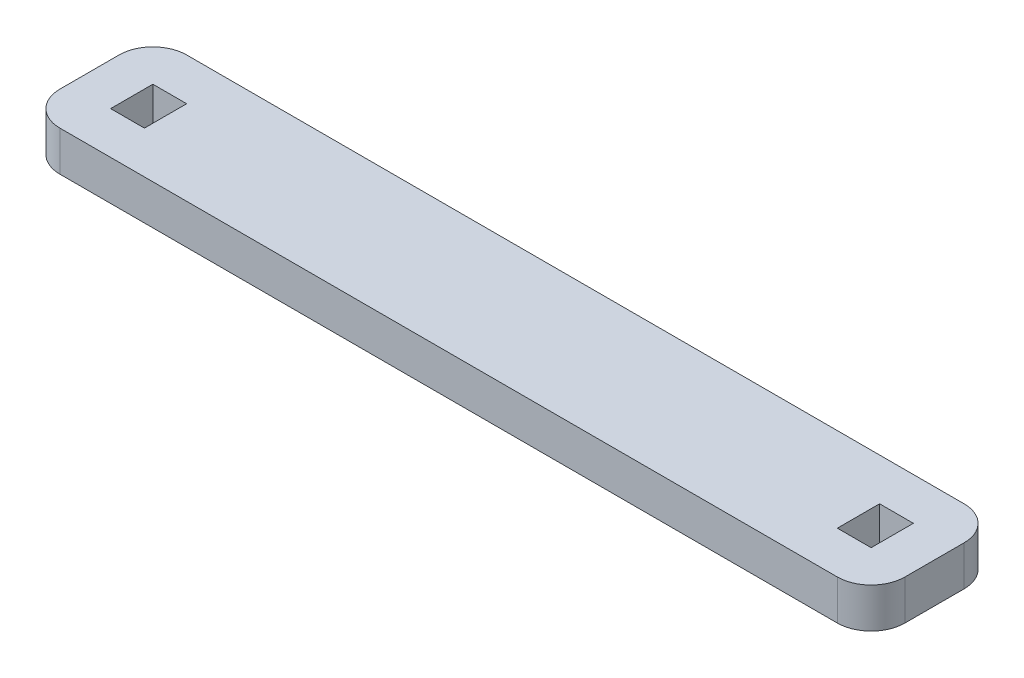
ISO-10303-21;
HEADER;
FILE_DESCRIPTION(('STEP AP214'),'2;1');
FILE_NAME('part.step','',(''),(''),'','','');
FILE_SCHEMA(('AUTOMOTIVE_DESIGN { 1 0 10303 214 1 1 1 1 }'));
ENDSEC;
DATA;
#1=APPLICATION_CONTEXT('core data for automotive mechanical design processes');
#2=APPLICATION_PROTOCOL_DEFINITION('international standard','automotive_design',2000,#1);
#3=PRODUCT_CONTEXT('',#1,'mechanical');
#4=PRODUCT('Part','Part','',(#3));
#5=PRODUCT_RELATED_PRODUCT_CATEGORY('part','',(#4));
#6=PRODUCT_DEFINITION_FORMATION('','',#4);
#7=PRODUCT_DEFINITION_CONTEXT('part definition',#1,'design');
#8=PRODUCT_DEFINITION('design','',#6,#7);
#9=PRODUCT_DEFINITION_SHAPE('','',#8);
#10=(LENGTH_UNIT() NAMED_UNIT(*) SI_UNIT(.MILLI.,.METRE.));
#11=(NAMED_UNIT(*) PLANE_ANGLE_UNIT() SI_UNIT($,.RADIAN.));
#12=(NAMED_UNIT(*) SI_UNIT($,.STERADIAN.) SOLID_ANGLE_UNIT());
#13=UNCERTAINTY_MEASURE_WITH_UNIT(LENGTH_MEASURE(1.E-05),#10,'distance_accuracy_value','');
#14=(GEOMETRIC_REPRESENTATION_CONTEXT(3) GLOBAL_UNCERTAINTY_ASSIGNED_CONTEXT((#13)) GLOBAL_UNIT_ASSIGNED_CONTEXT((#10,
#11,#12)) REPRESENTATION_CONTEXT('',''));
#15=CARTESIAN_POINT('',(0.,0.,0.));
#16=DIRECTION('',(0.,0.,1.));
#17=DIRECTION('',(1.,0.,0.));
#18=AXIS2_PLACEMENT_3D('',#15,#16,#17);
#19=CARTESIAN_POINT('',(0.,1.5,0.));
#20=DIRECTION('',(0.,1.,0.));
#21=DIRECTION('',(0.,0.,1.));
#22=AXIS2_PLACEMENT_3D('',#19,#20,#21);
#23=PLANE('',#22);
#24=DIRECTION('',(-1.,0.,0.));
#25=VECTOR('',#24,1.);
#26=CARTESIAN_POINT('',(31.75,1.5,-4.7625));
#27=LINE('',#26,#25);
#28=CARTESIAN_POINT('',(29.21,1.5,-4.7625));
#29=VERTEX_POINT('',#28);
#30=CARTESIAN_POINT('',(-29.21,1.5,-4.7625));
#31=VERTEX_POINT('',#30);
#32=EDGE_CURVE('E268',#29,#31,#27,.T.);
#33=ORIENTED_EDGE('',*,*,#32,.T.);
#34=CARTESIAN_POINT('',(-29.21,1.5,-2.2225));
#35=DIRECTION('',(0.,1.,0.));
#36=DIRECTION('',(0.,0.,1.));
#37=AXIS2_PLACEMENT_3D('',#34,#35,#36);
#38=CIRCLE('',#37,2.54);
#39=CARTESIAN_POINT('',(-31.75,1.5,-2.2225));
#40=VERTEX_POINT('',#39);
#41=EDGE_CURVE('E319',#31,#40,#38,.T.);
#42=ORIENTED_EDGE('',*,*,#41,.T.);
#43=DIRECTION('',(0.,0.,1.));
#44=VECTOR('',#43,1.);
#45=CARTESIAN_POINT('',(-31.75,1.5,4.7625));
#46=LINE('',#45,#44);
#47=CARTESIAN_POINT('',(-31.75,1.5,2.2225));
#48=VERTEX_POINT('',#47);
#49=EDGE_CURVE('E257',#40,#48,#46,.T.);
#50=ORIENTED_EDGE('',*,*,#49,.T.);
#51=CARTESIAN_POINT('',(-29.21,1.5,2.2225));
#52=DIRECTION('',(0.,1.,0.));
#53=DIRECTION('',(0.,0.,1.));
#54=AXIS2_PLACEMENT_3D('',#51,#52,#53);
#55=CIRCLE('',#54,2.54);
#56=CARTESIAN_POINT('',(-29.21,1.5,4.7625));
#57=VERTEX_POINT('',#56);
#58=EDGE_CURVE('E311',#48,#57,#55,.T.);
#59=ORIENTED_EDGE('',*,*,#58,.T.);
#60=DIRECTION('',(1.,0.,0.));
#61=VECTOR('',#60,1.);
#62=CARTESIAN_POINT('',(31.75,1.5,4.7625));
#63=LINE('',#62,#61);
#64=CARTESIAN_POINT('',(29.21,1.5,4.7625));
#65=VERTEX_POINT('',#64);
#66=EDGE_CURVE('E261',#57,#65,#63,.T.);
#67=ORIENTED_EDGE('',*,*,#66,.T.);
#68=CARTESIAN_POINT('',(29.21,1.5,2.2225));
#69=DIRECTION('',(0.,1.,0.));
#70=DIRECTION('',(0.,0.,1.));
#71=AXIS2_PLACEMENT_3D('',#68,#69,#70);
#72=CIRCLE('',#71,2.54);
#73=CARTESIAN_POINT('',(31.75,1.5,2.2225));
#74=VERTEX_POINT('',#73);
#75=EDGE_CURVE('E68',#65,#74,#72,.T.);
#76=ORIENTED_EDGE('',*,*,#75,.T.);
#77=DIRECTION('',(0.,0.,-1.));
#78=VECTOR('',#77,1.);
#79=CARTESIAN_POINT('',(31.75,1.5,4.7625));
#80=LINE('',#79,#78);
#81=CARTESIAN_POINT('',(31.75,1.5,-2.2225));
#82=VERTEX_POINT('',#81);
#83=EDGE_CURVE('E265',#74,#82,#80,.T.);
#84=ORIENTED_EDGE('',*,*,#83,.T.);
#85=CARTESIAN_POINT('',(29.21,1.5,-2.2225));
#86=DIRECTION('',(0.,1.,0.));
#87=DIRECTION('',(0.,0.,1.));
#88=AXIS2_PLACEMENT_3D('',#85,#86,#87);
#89=CIRCLE('',#88,2.54);
#90=EDGE_CURVE('E316',#82,#29,#89,.T.);
#91=ORIENTED_EDGE('',*,*,#90,.T.);
#92=EDGE_LOOP('',(#33,#42,#50,#59,#67,#76,#84,#91));
#93=FACE_BOUND('',#92,.T.);
#94=DIRECTION('',(1.,0.,0.));
#95=VECTOR('',#94,1.);
#96=CARTESIAN_POINT('',(-26.035,1.5,1.5875));
#97=LINE('',#96,#95);
#98=CARTESIAN_POINT('',(-28.575,1.5,1.5875));
#99=VERTEX_POINT('',#98);
#100=CARTESIAN_POINT('',(-26.035,1.5,1.5875));
#101=VERTEX_POINT('',#100);
#102=EDGE_CURVE('E217',#99,#101,#97,.T.);
#103=ORIENTED_EDGE('',*,*,#102,.F.);
#104=DIRECTION('',(0.,0.,1.));
#105=VECTOR('',#104,1.);
#106=CARTESIAN_POINT('',(-28.575,1.5,1.5875));
#107=LINE('',#106,#105);
#108=CARTESIAN_POINT('',(-28.575,1.5,-1.5875));
#109=VERTEX_POINT('',#108);
#110=EDGE_CURVE('E214',#109,#99,#107,.T.);
#111=ORIENTED_EDGE('',*,*,#110,.F.);
#112=DIRECTION('',(-1.,0.,0.));
#113=VECTOR('',#112,1.);
#114=CARTESIAN_POINT('',(-26.035,1.5,-1.5875));
#115=LINE('',#114,#113);
#116=CARTESIAN_POINT('',(-26.035,1.5,-1.5875));
#117=VERTEX_POINT('',#116);
#118=EDGE_CURVE('E225',#117,#109,#115,.T.);
#119=ORIENTED_EDGE('',*,*,#118,.F.);
#120=DIRECTION('',(0.,0.,-1.));
#121=VECTOR('',#120,1.);
#122=CARTESIAN_POINT('',(-26.035,1.5,1.5875));
#123=LINE('',#122,#121);
#124=EDGE_CURVE('E221',#101,#117,#123,.T.);
#125=ORIENTED_EDGE('',*,*,#124,.F.);
#126=EDGE_LOOP('',(#103,#111,#119,#125));
#127=FACE_BOUND('',#126,.T.);
#128=DIRECTION('',(1.,0.,0.));
#129=VECTOR('',#128,1.);
#130=CARTESIAN_POINT('',(28.575,1.5,1.5875));
#131=LINE('',#130,#129);
#132=CARTESIAN_POINT('',(26.035,1.5,1.5875));
#133=VERTEX_POINT('',#132);
#134=CARTESIAN_POINT('',(28.575,1.5,1.5875));
#135=VERTEX_POINT('',#134);
#136=EDGE_CURVE('E172',#133,#135,#131,.T.);
#137=ORIENTED_EDGE('',*,*,#136,.F.);
#138=DIRECTION('',(0.,0.,1.));
#139=VECTOR('',#138,1.);
#140=CARTESIAN_POINT('',(26.035,1.5,1.5875));
#141=LINE('',#140,#139);
#142=CARTESIAN_POINT('',(26.035,1.5,-1.5875));
#143=VERTEX_POINT('',#142);
#144=EDGE_CURVE('E161',#143,#133,#141,.T.);
#145=ORIENTED_EDGE('',*,*,#144,.F.);
#146=DIRECTION('',(-1.,0.,0.));
#147=VECTOR('',#146,1.);
#148=CARTESIAN_POINT('',(28.575,1.5,-1.5875));
#149=LINE('',#148,#147);
#150=CARTESIAN_POINT('',(28.575,1.5,-1.5875));
#151=VERTEX_POINT('',#150);
#152=EDGE_CURVE('E190',#151,#143,#149,.T.);
#153=ORIENTED_EDGE('',*,*,#152,.F.);
#154=DIRECTION('',(0.,0.,-1.));
#155=VECTOR('',#154,1.);
#156=CARTESIAN_POINT('',(28.575,1.5,1.5875));
#157=LINE('',#156,#155);
#158=EDGE_CURVE('E186',#135,#151,#157,.T.);
#159=ORIENTED_EDGE('',*,*,#158,.F.);
#160=EDGE_LOOP('',(#137,#145,#153,#159));
#161=FACE_BOUND('',#160,.T.);
#162=ADVANCED_FACE('F45',(#93,#127,#161),#23,.T.);
#163=CARTESIAN_POINT('',(0.,-1.5,0.));
#164=DIRECTION('',(0.,1.,0.));
#165=DIRECTION('',(0.,0.,1.));
#166=AXIS2_PLACEMENT_3D('',#163,#164,#165);
#167=PLANE('',#166);
#168=DIRECTION('',(0.,0.,1.));
#169=VECTOR('',#168,1.);
#170=CARTESIAN_POINT('',(-28.575,-1.5,1.5875));
#171=LINE('',#170,#169);
#172=CARTESIAN_POINT('',(-28.575,-1.5,-1.5875));
#173=VERTEX_POINT('',#172);
#174=CARTESIAN_POINT('',(-28.575,-1.5,1.5875));
#175=VERTEX_POINT('',#174);
#176=EDGE_CURVE('E181',#173,#175,#171,.T.);
#177=ORIENTED_EDGE('',*,*,#176,.T.);
#178=DIRECTION('',(1.,0.,0.));
#179=VECTOR('',#178,1.);
#180=CARTESIAN_POINT('',(-26.035,-1.5,1.5875));
#181=LINE('',#180,#179);
#182=CARTESIAN_POINT('',(-26.035,-1.5,1.5875));
#183=VERTEX_POINT('',#182);
#184=EDGE_CURVE('E232',#175,#183,#181,.T.);
#185=ORIENTED_EDGE('',*,*,#184,.T.);
#186=DIRECTION('',(0.,0.,-1.));
#187=VECTOR('',#186,1.);
#188=CARTESIAN_POINT('',(-26.035,-1.5,1.5875));
#189=LINE('',#188,#187);
#190=CARTESIAN_POINT('',(-26.035,-1.5,-1.5875));
#191=VERTEX_POINT('',#190);
#192=EDGE_CURVE('E236',#183,#191,#189,.T.);
#193=ORIENTED_EDGE('',*,*,#192,.T.);
#194=DIRECTION('',(-1.,0.,0.));
#195=VECTOR('',#194,1.);
#196=CARTESIAN_POINT('',(-26.035,-1.5,-1.5875));
#197=LINE('',#196,#195);
#198=EDGE_CURVE('E218',#191,#173,#197,.T.);
#199=ORIENTED_EDGE('',*,*,#198,.T.);
#200=EDGE_LOOP('',(#177,#185,#193,#199));
#201=FACE_BOUND('',#200,.T.);
#202=DIRECTION('',(0.,0.,1.));
#203=VECTOR('',#202,1.);
#204=CARTESIAN_POINT('',(-31.75,-1.5,4.7625));
#205=LINE('',#204,#203);
#206=CARTESIAN_POINT('',(-31.75,-1.5,-2.2225));
#207=VERTEX_POINT('',#206);
#208=CARTESIAN_POINT('',(-31.75,-1.5,2.2225));
#209=VERTEX_POINT('',#208);
#210=EDGE_CURVE('E256',#207,#209,#205,.T.);
#211=ORIENTED_EDGE('',*,*,#210,.F.);
#212=CARTESIAN_POINT('',(-29.21,-1.5,-2.2225));
#213=DIRECTION('',(0.,1.,0.));
#214=DIRECTION('',(0.,0.,1.));
#215=AXIS2_PLACEMENT_3D('',#212,#213,#214);
#216=CIRCLE('',#215,2.54);
#217=CARTESIAN_POINT('',(-29.21,-1.5,-4.7625));
#218=VERTEX_POINT('',#217);
#219=EDGE_CURVE('E301',#207,#218,#216,.F.);
#220=ORIENTED_EDGE('',*,*,#219,.T.);
#221=DIRECTION('',(-1.,0.,0.));
#222=VECTOR('',#221,1.);
#223=CARTESIAN_POINT('',(31.75,-1.5,-4.7625));
#224=LINE('',#223,#222);
#225=CARTESIAN_POINT('',(29.21,-1.5,-4.7625));
#226=VERTEX_POINT('',#225);
#227=EDGE_CURVE('E262',#226,#218,#224,.T.);
#228=ORIENTED_EDGE('',*,*,#227,.F.);
#229=CARTESIAN_POINT('',(29.21,-1.5,-2.2225));
#230=DIRECTION('',(0.,1.,0.));
#231=DIRECTION('',(0.,0.,1.));
#232=AXIS2_PLACEMENT_3D('',#229,#230,#231);
#233=CIRCLE('',#232,2.54);
#234=CARTESIAN_POINT('',(31.75,-1.5,-2.2225));
#235=VERTEX_POINT('',#234);
#236=EDGE_CURVE('E298',#226,#235,#233,.F.);
#237=ORIENTED_EDGE('',*,*,#236,.T.);
#238=DIRECTION('',(0.,0.,-1.));
#239=VECTOR('',#238,1.);
#240=CARTESIAN_POINT('',(31.75,-1.5,4.7625));
#241=LINE('',#240,#239);
#242=CARTESIAN_POINT('',(31.75,-1.5,2.2225));
#243=VERTEX_POINT('',#242);
#244=EDGE_CURVE('E280',#243,#235,#241,.T.);
#245=ORIENTED_EDGE('',*,*,#244,.F.);
#246=CARTESIAN_POINT('',(29.21,-1.5,2.2225));
#247=DIRECTION('',(0.,1.,0.));
#248=DIRECTION('',(0.,0.,1.));
#249=AXIS2_PLACEMENT_3D('',#246,#247,#248);
#250=CIRCLE('',#249,2.54);
#251=CARTESIAN_POINT('',(29.21,-1.5,4.7625));
#252=VERTEX_POINT('',#251);
#253=EDGE_CURVE('E295',#243,#252,#250,.F.);
#254=ORIENTED_EDGE('',*,*,#253,.T.);
#255=DIRECTION('',(1.,0.,0.));
#256=VECTOR('',#255,1.);
#257=CARTESIAN_POINT('',(31.75,-1.5,4.7625));
#258=LINE('',#257,#256);
#259=CARTESIAN_POINT('',(-29.21,-1.5,4.7625));
#260=VERTEX_POINT('',#259);
#261=EDGE_CURVE('E276',#260,#252,#258,.T.);
#262=ORIENTED_EDGE('',*,*,#261,.F.);
#263=CARTESIAN_POINT('',(-29.21,-1.5,2.2225));
#264=DIRECTION('',(0.,1.,0.));
#265=DIRECTION('',(0.,0.,1.));
#266=AXIS2_PLACEMENT_3D('',#263,#264,#265);
#267=CIRCLE('',#266,2.54);
#268=EDGE_CURVE('E292',#260,#209,#267,.F.);
#269=ORIENTED_EDGE('',*,*,#268,.T.);
#270=EDGE_LOOP('',(#211,#220,#228,#237,#245,#254,#262,#269));
#271=FACE_BOUND('',#270,.T.);
#272=DIRECTION('',(0.,0.,1.));
#273=VECTOR('',#272,1.);
#274=CARTESIAN_POINT('',(26.035,-1.5,1.5875));
#275=LINE('',#274,#273);
#276=CARTESIAN_POINT('',(26.035,-1.5,-1.5875));
#277=VERTEX_POINT('',#276);
#278=CARTESIAN_POINT('',(26.035,-1.5,1.5875));
#279=VERTEX_POINT('',#278);
#280=EDGE_CURVE('E195',#277,#279,#275,.T.);
#281=ORIENTED_EDGE('',*,*,#280,.T.);
#282=DIRECTION('',(1.,0.,0.));
#283=VECTOR('',#282,1.);
#284=CARTESIAN_POINT('',(28.575,-1.5,1.5875));
#285=LINE('',#284,#283);
#286=CARTESIAN_POINT('',(28.575,-1.5,1.5875));
#287=VERTEX_POINT('',#286);
#288=EDGE_CURVE('E179',#279,#287,#285,.T.);
#289=ORIENTED_EDGE('',*,*,#288,.T.);
#290=DIRECTION('',(0.,0.,-1.));
#291=VECTOR('',#290,1.);
#292=CARTESIAN_POINT('',(28.575,-1.5,1.5875));
#293=LINE('',#292,#291);
#294=CARTESIAN_POINT('',(28.575,-1.5,-1.5875));
#295=VERTEX_POINT('',#294);
#296=EDGE_CURVE('E200',#287,#295,#293,.T.);
#297=ORIENTED_EDGE('',*,*,#296,.T.);
#298=DIRECTION('',(-1.,0.,0.));
#299=VECTOR('',#298,1.);
#300=CARTESIAN_POINT('',(28.575,-1.5,-1.5875));
#301=LINE('',#300,#299);
#302=EDGE_CURVE('E173',#295,#277,#301,.T.);
#303=ORIENTED_EDGE('',*,*,#302,.T.);
#304=EDGE_LOOP('',(#281,#289,#297,#303));
#305=FACE_BOUND('',#304,.T.);
#306=ADVANCED_FACE('F339',(#201,#271,#305),#167,.F.);
#307=CARTESIAN_POINT('',(-31.75,1.5,4.7625));
#308=DIRECTION('',(1.,0.,0.));
#309=DIRECTION('',(0.,0.,-1.));
#310=AXIS2_PLACEMENT_3D('',#307,#308,#309);
#311=PLANE('',#310);
#312=ORIENTED_EDGE('',*,*,#49,.F.);
#313=DIRECTION('',(0.,-1.,0.));
#314=VECTOR('',#313,1.);
#315=CARTESIAN_POINT('',(-31.75,1.5,-2.2225));
#316=LINE('',#315,#314);
#317=EDGE_CURVE('E288',#40,#207,#316,.T.);
#318=ORIENTED_EDGE('',*,*,#317,.T.);
#319=ORIENTED_EDGE('',*,*,#210,.T.);
#320=DIRECTION('',(0.,-1.,0.));
#321=VECTOR('',#320,1.);
#322=CARTESIAN_POINT('',(-31.75,1.5,2.2225));
#323=LINE('',#322,#321);
#324=EDGE_CURVE('E272',#209,#48,#323,.F.);
#325=ORIENTED_EDGE('',*,*,#324,.T.);
#326=EDGE_LOOP('',(#312,#318,#319,#325));
#327=FACE_BOUND('',#326,.T.);
#328=ADVANCED_FACE('F362',(#327),#311,.F.);
#329=CARTESIAN_POINT('',(31.75,1.5,4.7625));
#330=DIRECTION('',(0.,0.,-1.));
#331=DIRECTION('',(-1.,0.,0.));
#332=AXIS2_PLACEMENT_3D('',#329,#330,#331);
#333=PLANE('',#332);
#334=ORIENTED_EDGE('',*,*,#261,.T.);
#335=DIRECTION('',(0.,-1.,0.));
#336=VECTOR('',#335,1.);
#337=CARTESIAN_POINT('',(29.21,1.5,4.7625));
#338=LINE('',#337,#336);
#339=EDGE_CURVE('E11',#252,#65,#338,.F.);
#340=ORIENTED_EDGE('',*,*,#339,.T.);
#341=ORIENTED_EDGE('',*,*,#66,.F.);
#342=DIRECTION('',(0.,-1.,0.));
#343=VECTOR('',#342,1.);
#344=CARTESIAN_POINT('',(-29.21,1.5,4.7625));
#345=LINE('',#344,#343);
#346=EDGE_CURVE('E54',#57,#260,#345,.T.);
#347=ORIENTED_EDGE('',*,*,#346,.T.);
#348=EDGE_LOOP('',(#334,#340,#341,#347));
#349=FACE_BOUND('',#348,.T.);
#350=ADVANCED_FACE('F333',(#349),#333,.F.);
#351=CARTESIAN_POINT('',(31.75,1.5,4.7625));
#352=DIRECTION('',(-1.,0.,0.));
#353=DIRECTION('',(0.,0.,1.));
#354=AXIS2_PLACEMENT_3D('',#351,#352,#353);
#355=PLANE('',#354);
#356=ORIENTED_EDGE('',*,*,#244,.T.);
#357=DIRECTION('',(0.,-1.,0.));
#358=VECTOR('',#357,1.);
#359=CARTESIAN_POINT('',(31.75,1.5,-2.2225));
#360=LINE('',#359,#358);
#361=EDGE_CURVE('E61',#235,#82,#360,.F.);
#362=ORIENTED_EDGE('',*,*,#361,.T.);
#363=ORIENTED_EDGE('',*,*,#83,.F.);
#364=DIRECTION('',(0.,-1.,0.));
#365=VECTOR('',#364,1.);
#366=CARTESIAN_POINT('',(31.75,1.5,2.2225));
#367=LINE('',#366,#365);
#368=EDGE_CURVE('E322',#74,#243,#367,.T.);
#369=ORIENTED_EDGE('',*,*,#368,.T.);
#370=EDGE_LOOP('',(#356,#362,#363,#369));
#371=FACE_BOUND('',#370,.T.);
#372=ADVANCED_FACE('F345',(#371),#355,.F.);
#373=CARTESIAN_POINT('',(31.75,1.5,-4.7625));
#374=DIRECTION('',(0.,0.,1.));
#375=DIRECTION('',(1.,0.,0.));
#376=AXIS2_PLACEMENT_3D('',#373,#374,#375);
#377=PLANE('',#376);
#378=ORIENTED_EDGE('',*,*,#227,.T.);
#379=DIRECTION('',(0.,-1.,0.));
#380=VECTOR('',#379,1.);
#381=CARTESIAN_POINT('',(-29.21,1.5,-4.7625));
#382=LINE('',#381,#380);
#383=EDGE_CURVE('E308',#218,#31,#382,.F.);
#384=ORIENTED_EDGE('',*,*,#383,.T.);
#385=ORIENTED_EDGE('',*,*,#32,.F.);
#386=DIRECTION('',(0.,-1.,0.));
#387=VECTOR('',#386,1.);
#388=CARTESIAN_POINT('',(29.21,1.5,-4.7625));
#389=LINE('',#388,#387);
#390=EDGE_CURVE('E304',#29,#226,#389,.T.);
#391=ORIENTED_EDGE('',*,*,#390,.T.);
#392=EDGE_LOOP('',(#378,#384,#385,#391));
#393=FACE_BOUND('',#392,.T.);
#394=ADVANCED_FACE('F354',(#393),#377,.F.);
#395=CARTESIAN_POINT('',(-28.575,1.5,1.5875));
#396=DIRECTION('',(1.,0.,0.));
#397=DIRECTION('',(0.,0.,-1.));
#398=AXIS2_PLACEMENT_3D('',#395,#396,#397);
#399=PLANE('',#398);
#400=ORIENTED_EDGE('',*,*,#176,.F.);
#401=DIRECTION('',(0.,-1.,0.));
#402=VECTOR('',#401,1.);
#403=CARTESIAN_POINT('',(-28.575,1.5,-1.5875));
#404=LINE('',#403,#402);
#405=EDGE_CURVE('E228',#109,#173,#404,.T.);
#406=ORIENTED_EDGE('',*,*,#405,.F.);
#407=ORIENTED_EDGE('',*,*,#110,.T.);
#408=DIRECTION('',(0.,-1.,0.));
#409=VECTOR('',#408,1.);
#410=CARTESIAN_POINT('',(-28.575,1.5,1.5875));
#411=LINE('',#410,#409);
#412=EDGE_CURVE('E252',#99,#175,#411,.T.);
#413=ORIENTED_EDGE('',*,*,#412,.T.);
#414=EDGE_LOOP('',(#400,#406,#407,#413));
#415=FACE_BOUND('',#414,.T.);
#416=ADVANCED_FACE('F377',(#415),#399,.T.);
#417=CARTESIAN_POINT('',(-26.035,1.5,1.5875));
#418=DIRECTION('',(0.,0.,-1.));
#419=DIRECTION('',(-1.,0.,0.));
#420=AXIS2_PLACEMENT_3D('',#417,#418,#419);
#421=PLANE('',#420);
#422=ORIENTED_EDGE('',*,*,#184,.F.);
#423=ORIENTED_EDGE('',*,*,#412,.F.);
#424=ORIENTED_EDGE('',*,*,#102,.T.);
#425=DIRECTION('',(0.,-1.,0.));
#426=VECTOR('',#425,1.);
#427=CARTESIAN_POINT('',(-26.035,1.5,1.5875));
#428=LINE('',#427,#426);
#429=EDGE_CURVE('E249',#101,#183,#428,.T.);
#430=ORIENTED_EDGE('',*,*,#429,.T.);
#431=EDGE_LOOP('',(#422,#423,#424,#430));
#432=FACE_BOUND('',#431,.T.);
#433=ADVANCED_FACE('F459',(#432),#421,.T.);
#434=CARTESIAN_POINT('',(-26.035,1.5,1.5875));
#435=DIRECTION('',(-1.,0.,0.));
#436=DIRECTION('',(0.,0.,1.));
#437=AXIS2_PLACEMENT_3D('',#434,#435,#436);
#438=PLANE('',#437);
#439=ORIENTED_EDGE('',*,*,#192,.F.);
#440=ORIENTED_EDGE('',*,*,#429,.F.);
#441=ORIENTED_EDGE('',*,*,#124,.T.);
#442=DIRECTION('',(0.,-1.,0.));
#443=VECTOR('',#442,1.);
#444=CARTESIAN_POINT('',(-26.035,1.5,-1.5875));
#445=LINE('',#444,#443);
#446=EDGE_CURVE('E246',#117,#191,#445,.T.);
#447=ORIENTED_EDGE('',*,*,#446,.T.);
#448=EDGE_LOOP('',(#439,#440,#441,#447));
#449=FACE_BOUND('',#448,.T.);
#450=ADVANCED_FACE('F450',(#449),#438,.T.);
#451=CARTESIAN_POINT('',(-26.035,1.5,-1.5875));
#452=DIRECTION('',(0.,0.,1.));
#453=DIRECTION('',(1.,0.,0.));
#454=AXIS2_PLACEMENT_3D('',#451,#452,#453);
#455=PLANE('',#454);
#456=ORIENTED_EDGE('',*,*,#198,.F.);
#457=ORIENTED_EDGE('',*,*,#446,.F.);
#458=ORIENTED_EDGE('',*,*,#118,.T.);
#459=ORIENTED_EDGE('',*,*,#405,.T.);
#460=EDGE_LOOP('',(#456,#457,#458,#459));
#461=FACE_BOUND('',#460,.T.);
#462=ADVANCED_FACE('F442',(#461),#455,.T.);
#463=CARTESIAN_POINT('',(26.035,1.5,1.5875));
#464=DIRECTION('',(1.,0.,0.));
#465=DIRECTION('',(0.,0.,-1.));
#466=AXIS2_PLACEMENT_3D('',#463,#464,#465);
#467=PLANE('',#466);
#468=ORIENTED_EDGE('',*,*,#280,.F.);
#469=DIRECTION('',(0.,-1.,0.));
#470=VECTOR('',#469,1.);
#471=CARTESIAN_POINT('',(26.035,1.5,-1.5875));
#472=LINE('',#471,#470);
#473=EDGE_CURVE('E167',#143,#277,#472,.T.);
#474=ORIENTED_EDGE('',*,*,#473,.F.);
#475=ORIENTED_EDGE('',*,*,#144,.T.);
#476=DIRECTION('',(0.,-1.,0.));
#477=VECTOR('',#476,1.);
#478=CARTESIAN_POINT('',(26.035,1.5,1.5875));
#479=LINE('',#478,#477);
#480=EDGE_CURVE('E164',#133,#279,#479,.T.);
#481=ORIENTED_EDGE('',*,*,#480,.T.);
#482=EDGE_LOOP('',(#468,#474,#475,#481));
#483=FACE_BOUND('',#482,.T.);
#484=ADVANCED_FACE('F163',(#483),#467,.T.);
#485=CARTESIAN_POINT('',(28.575,1.5,1.5875));
#486=DIRECTION('',(0.,0.,-1.));
#487=DIRECTION('',(-1.,0.,0.));
#488=AXIS2_PLACEMENT_3D('',#485,#486,#487);
#489=PLANE('',#488);
#490=ORIENTED_EDGE('',*,*,#288,.F.);
#491=ORIENTED_EDGE('',*,*,#480,.F.);
#492=ORIENTED_EDGE('',*,*,#136,.T.);
#493=DIRECTION('',(0.,-1.,0.));
#494=VECTOR('',#493,1.);
#495=CARTESIAN_POINT('',(28.575,1.5,1.5875));
#496=LINE('',#495,#494);
#497=EDGE_CURVE('E182',#135,#287,#496,.T.);
#498=ORIENTED_EDGE('',*,*,#497,.T.);
#499=EDGE_LOOP('',(#490,#491,#492,#498));
#500=FACE_BOUND('',#499,.T.);
#501=ADVANCED_FACE('F176',(#500),#489,.T.);
#502=CARTESIAN_POINT('',(28.575,1.5,1.5875));
#503=DIRECTION('',(-1.,0.,0.));
#504=DIRECTION('',(0.,0.,1.));
#505=AXIS2_PLACEMENT_3D('',#502,#503,#504);
#506=PLANE('',#505);
#507=ORIENTED_EDGE('',*,*,#296,.F.);
#508=ORIENTED_EDGE('',*,*,#497,.F.);
#509=ORIENTED_EDGE('',*,*,#158,.T.);
#510=DIRECTION('',(0.,-1.,0.));
#511=VECTOR('',#510,1.);
#512=CARTESIAN_POINT('',(28.575,1.5,-1.5875));
#513=LINE('',#512,#511);
#514=EDGE_CURVE('E209',#151,#295,#513,.T.);
#515=ORIENTED_EDGE('',*,*,#514,.T.);
#516=EDGE_LOOP('',(#507,#508,#509,#515));
#517=FACE_BOUND('',#516,.T.);
#518=ADVANCED_FACE('F418',(#517),#506,.T.);
#519=CARTESIAN_POINT('',(28.575,1.5,-1.5875));
#520=DIRECTION('',(0.,0.,1.));
#521=DIRECTION('',(1.,0.,0.));
#522=AXIS2_PLACEMENT_3D('',#519,#520,#521);
#523=PLANE('',#522);
#524=ORIENTED_EDGE('',*,*,#302,.F.);
#525=ORIENTED_EDGE('',*,*,#514,.F.);
#526=ORIENTED_EDGE('',*,*,#152,.T.);
#527=ORIENTED_EDGE('',*,*,#473,.T.);
#528=EDGE_LOOP('',(#524,#525,#526,#527));
#529=FACE_BOUND('',#528,.T.);
#530=ADVANCED_FACE('F390',(#529),#523,.T.);
#531=CARTESIAN_POINT('',(-29.21,1.5,-2.2225));
#532=DIRECTION('',(0.,-1.,0.));
#533=DIRECTION('',(0.,0.,-1.));
#534=AXIS2_PLACEMENT_3D('',#531,#532,#533);
#535=CYLINDRICAL_SURFACE('',#534,2.54);
#536=ORIENTED_EDGE('',*,*,#41,.F.);
#537=ORIENTED_EDGE('',*,*,#383,.F.);
#538=ORIENTED_EDGE('',*,*,#219,.F.);
#539=ORIENTED_EDGE('',*,*,#317,.F.);
#540=EDGE_LOOP('',(#536,#537,#538,#539));
#541=FACE_BOUND('',#540,.T.);
#542=ADVANCED_FACE('F359',(#541),#535,.T.);
#543=CARTESIAN_POINT('',(29.21,1.5,-2.2225));
#544=DIRECTION('',(0.,-1.,0.));
#545=DIRECTION('',(0.,0.,-1.));
#546=AXIS2_PLACEMENT_3D('',#543,#544,#545);
#547=CYLINDRICAL_SURFACE('',#546,2.54);
#548=ORIENTED_EDGE('',*,*,#90,.F.);
#549=ORIENTED_EDGE('',*,*,#361,.F.);
#550=ORIENTED_EDGE('',*,*,#236,.F.);
#551=ORIENTED_EDGE('',*,*,#390,.F.);
#552=EDGE_LOOP('',(#548,#549,#550,#551));
#553=FACE_BOUND('',#552,.T.);
#554=ADVANCED_FACE('F351',(#553),#547,.T.);
#555=CARTESIAN_POINT('',(29.21,1.5,2.2225));
#556=DIRECTION('',(0.,-1.,0.));
#557=DIRECTION('',(0.,0.,-1.));
#558=AXIS2_PLACEMENT_3D('',#555,#556,#557);
#559=CYLINDRICAL_SURFACE('',#558,2.54);
#560=ORIENTED_EDGE('',*,*,#75,.F.);
#561=ORIENTED_EDGE('',*,*,#339,.F.);
#562=ORIENTED_EDGE('',*,*,#253,.F.);
#563=ORIENTED_EDGE('',*,*,#368,.F.);
#564=EDGE_LOOP('',(#560,#561,#562,#563));
#565=FACE_BOUND('',#564,.T.);
#566=ADVANCED_FACE('F344',(#565),#559,.T.);
#567=CARTESIAN_POINT('',(-29.21,1.5,2.2225));
#568=DIRECTION('',(0.,-1.,0.));
#569=DIRECTION('',(0.,0.,-1.));
#570=AXIS2_PLACEMENT_3D('',#567,#568,#569);
#571=CYLINDRICAL_SURFACE('',#570,2.54);
#572=ORIENTED_EDGE('',*,*,#58,.F.);
#573=ORIENTED_EDGE('',*,*,#324,.F.);
#574=ORIENTED_EDGE('',*,*,#268,.F.);
#575=ORIENTED_EDGE('',*,*,#346,.F.);
#576=EDGE_LOOP('',(#572,#573,#574,#575));
#577=FACE_BOUND('',#576,.T.);
#578=ADVANCED_FACE('F47',(#577),#571,.T.);
#579=CLOSED_SHELL('',(#162,#306,#328,#350,#372,#394,#416,#433,#450,#462,#484,#501,#518,#530,
#542,#554,#566,#578));
#580=MANIFOLD_SOLID_BREP('B2',#579);
#581=ADVANCED_BREP_SHAPE_REPRESENTATION('',(#18,#580),#14);
#582=SHAPE_DEFINITION_REPRESENTATION(#9,#581);
ENDSEC;
END-ISO-10303-21;
